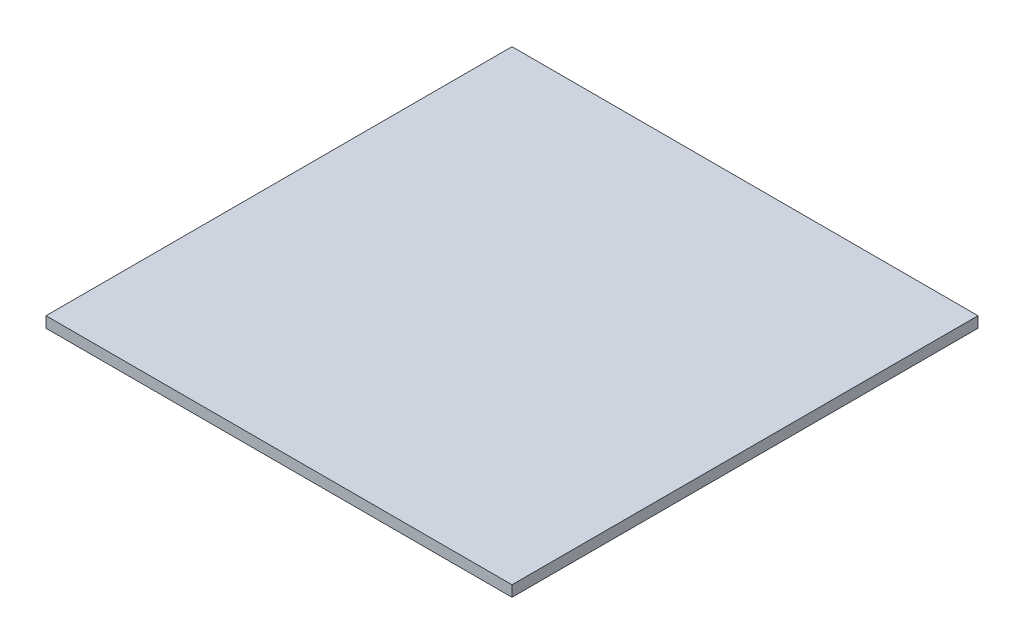
ISO-10303-21;
HEADER;
FILE_DESCRIPTION(('STEP AP214'),'2;1');
FILE_NAME('part.step','',(''),(''),'','','');
FILE_SCHEMA(('AUTOMOTIVE_DESIGN { 1 0 10303 214 1 1 1 1 }'));
ENDSEC;
DATA;
#1=APPLICATION_CONTEXT('core data for automotive mechanical design processes');
#2=APPLICATION_PROTOCOL_DEFINITION('international standard','automotive_design',2000,#1);
#3=PRODUCT_CONTEXT('',#1,'mechanical');
#4=PRODUCT('Part','Part','',(#3));
#5=PRODUCT_RELATED_PRODUCT_CATEGORY('part','',(#4));
#6=PRODUCT_DEFINITION_FORMATION('','',#4);
#7=PRODUCT_DEFINITION_CONTEXT('part definition',#1,'design');
#8=PRODUCT_DEFINITION('design','',#6,#7);
#9=PRODUCT_DEFINITION_SHAPE('','',#8);
#10=(LENGTH_UNIT() NAMED_UNIT(*) SI_UNIT(.MILLI.,.METRE.));
#11=(NAMED_UNIT(*) PLANE_ANGLE_UNIT() SI_UNIT($,.RADIAN.));
#12=(NAMED_UNIT(*) SI_UNIT($,.STERADIAN.) SOLID_ANGLE_UNIT());
#13=UNCERTAINTY_MEASURE_WITH_UNIT(LENGTH_MEASURE(1.E-05),#10,'distance_accuracy_value','');
#14=(GEOMETRIC_REPRESENTATION_CONTEXT(3) GLOBAL_UNCERTAINTY_ASSIGNED_CONTEXT((#13)) GLOBAL_UNIT_ASSIGNED_CONTEXT((#10,
#11,#12)) REPRESENTATION_CONTEXT('',''));
#15=CARTESIAN_POINT('',(0.,0.,0.));
#16=DIRECTION('',(0.,0.,1.));
#17=DIRECTION('',(1.,0.,0.));
#18=AXIS2_PLACEMENT_3D('',#15,#16,#17);
#19=CARTESIAN_POINT('',(107.,5.,107.));
#20=DIRECTION('',(-1.,0.,0.));
#21=DIRECTION('',(0.,0.,1.));
#22=AXIS2_PLACEMENT_3D('',#19,#20,#21);
#23=PLANE('',#22);
#24=DIRECTION('',(0.,0.,-1.));
#25=VECTOR('',#24,1.);
#26=CARTESIAN_POINT('',(107.,0.,107.));
#27=LINE('',#26,#25);
#28=CARTESIAN_POINT('',(107.,0.,107.));
#29=VERTEX_POINT('',#28);
#30=CARTESIAN_POINT('',(107.,0.,-107.));
#31=VERTEX_POINT('',#30);
#32=EDGE_CURVE('E99',#29,#31,#27,.T.);
#33=ORIENTED_EDGE('',*,*,#32,.T.);
#34=DIRECTION('',(0.,-1.,0.));
#35=VECTOR('',#34,1.);
#36=CARTESIAN_POINT('',(107.,5.,-107.));
#37=LINE('',#36,#35);
#38=CARTESIAN_POINT('',(107.,5.,-107.));
#39=VERTEX_POINT('',#38);
#40=EDGE_CURVE('E11',#39,#31,#37,.T.);
#41=ORIENTED_EDGE('',*,*,#40,.F.);
#42=DIRECTION('',(0.,0.,-1.));
#43=VECTOR('',#42,1.);
#44=CARTESIAN_POINT('',(107.,5.,107.));
#45=LINE('',#44,#43);
#46=CARTESIAN_POINT('',(107.,5.,107.));
#47=VERTEX_POINT('',#46);
#48=EDGE_CURVE('E87',#47,#39,#45,.T.);
#49=ORIENTED_EDGE('',*,*,#48,.F.);
#50=DIRECTION('',(0.,-1.,0.));
#51=VECTOR('',#50,1.);
#52=CARTESIAN_POINT('',(107.,5.,107.));
#53=LINE('',#52,#51);
#54=EDGE_CURVE('E95',#47,#29,#53,.T.);
#55=ORIENTED_EDGE('',*,*,#54,.T.);
#56=EDGE_LOOP('',(#33,#41,#49,#55));
#57=FACE_BOUND('',#56,.T.);
#58=ADVANCED_FACE('F36',(#57),#23,.F.);
#59=CARTESIAN_POINT('',(-107.,5.,-107.));
#60=DIRECTION('',(0.,0.,1.));
#61=DIRECTION('',(1.,0.,0.));
#62=AXIS2_PLACEMENT_3D('',#59,#60,#61);
#63=PLANE('',#62);
#64=DIRECTION('',(-1.,0.,0.));
#65=VECTOR('',#64,1.);
#66=CARTESIAN_POINT('',(-107.,0.,-107.));
#67=LINE('',#66,#65);
#68=CARTESIAN_POINT('',(-107.,0.,-107.));
#69=VERTEX_POINT('',#68);
#70=EDGE_CURVE('E91',#31,#69,#67,.T.);
#71=ORIENTED_EDGE('',*,*,#70,.T.);
#72=DIRECTION('',(0.,-1.,0.));
#73=VECTOR('',#72,1.);
#74=CARTESIAN_POINT('',(-107.,5.,-107.));
#75=LINE('',#74,#73);
#76=CARTESIAN_POINT('',(-107.,5.,-107.));
#77=VERTEX_POINT('',#76);
#78=EDGE_CURVE('E44',#77,#69,#75,.T.);
#79=ORIENTED_EDGE('',*,*,#78,.F.);
#80=DIRECTION('',(-1.,0.,0.));
#81=VECTOR('',#80,1.);
#82=CARTESIAN_POINT('',(-107.,5.,-107.));
#83=LINE('',#82,#81);
#84=EDGE_CURVE('E82',#39,#77,#83,.T.);
#85=ORIENTED_EDGE('',*,*,#84,.F.);
#86=ORIENTED_EDGE('',*,*,#40,.T.);
#87=EDGE_LOOP('',(#71,#79,#85,#86));
#88=FACE_BOUND('',#87,.T.);
#89=ADVANCED_FACE('F90',(#88),#63,.F.);
#90=CARTESIAN_POINT('',(-107.,5.,107.));
#91=DIRECTION('',(1.,0.,0.));
#92=DIRECTION('',(0.,0.,-1.));
#93=AXIS2_PLACEMENT_3D('',#90,#91,#92);
#94=PLANE('',#93);
#95=DIRECTION('',(0.,0.,1.));
#96=VECTOR('',#95,1.);
#97=CARTESIAN_POINT('',(-107.,0.,107.));
#98=LINE('',#97,#96);
#99=CARTESIAN_POINT('',(-107.,0.,107.));
#100=VERTEX_POINT('',#99);
#101=EDGE_CURVE('E69',#69,#100,#98,.T.);
#102=ORIENTED_EDGE('',*,*,#101,.T.);
#103=DIRECTION('',(0.,-1.,0.));
#104=VECTOR('',#103,1.);
#105=CARTESIAN_POINT('',(-107.,5.,107.));
#106=LINE('',#105,#104);
#107=CARTESIAN_POINT('',(-107.,5.,107.));
#108=VERTEX_POINT('',#107);
#109=EDGE_CURVE('E92',#108,#100,#106,.T.);
#110=ORIENTED_EDGE('',*,*,#109,.F.);
#111=DIRECTION('',(0.,0.,1.));
#112=VECTOR('',#111,1.);
#113=CARTESIAN_POINT('',(-107.,5.,107.));
#114=LINE('',#113,#112);
#115=EDGE_CURVE('E85',#77,#108,#114,.T.);
#116=ORIENTED_EDGE('',*,*,#115,.F.);
#117=ORIENTED_EDGE('',*,*,#78,.T.);
#118=EDGE_LOOP('',(#102,#110,#116,#117));
#119=FACE_BOUND('',#118,.T.);
#120=ADVANCED_FACE('F93',(#119),#94,.F.);
#121=CARTESIAN_POINT('',(-107.,5.,107.));
#122=DIRECTION('',(0.,0.,-1.));
#123=DIRECTION('',(-1.,0.,0.));
#124=AXIS2_PLACEMENT_3D('',#121,#122,#123);
#125=PLANE('',#124);
#126=DIRECTION('',(1.,0.,0.));
#127=VECTOR('',#126,1.);
#128=CARTESIAN_POINT('',(-107.,0.,107.));
#129=LINE('',#128,#127);
#130=EDGE_CURVE('E75',#100,#29,#129,.T.);
#131=ORIENTED_EDGE('',*,*,#130,.T.);
#132=ORIENTED_EDGE('',*,*,#54,.F.);
#133=DIRECTION('',(1.,0.,0.));
#134=VECTOR('',#133,1.);
#135=CARTESIAN_POINT('',(-107.,5.,107.));
#136=LINE('',#135,#134);
#137=EDGE_CURVE('E52',#108,#47,#136,.T.);
#138=ORIENTED_EDGE('',*,*,#137,.F.);
#139=ORIENTED_EDGE('',*,*,#109,.T.);
#140=EDGE_LOOP('',(#131,#132,#138,#139));
#141=FACE_BOUND('',#140,.T.);
#142=ADVANCED_FACE('F106',(#141),#125,.F.);
#143=CARTESIAN_POINT('',(0.,5.,0.));
#144=DIRECTION('',(0.,-1.,0.));
#145=DIRECTION('',(0.,0.,-1.));
#146=AXIS2_PLACEMENT_3D('',#143,#144,#145);
#147=PLANE('',#146);
#148=ORIENTED_EDGE('',*,*,#48,.T.);
#149=ORIENTED_EDGE('',*,*,#84,.T.);
#150=ORIENTED_EDGE('',*,*,#115,.T.);
#151=ORIENTED_EDGE('',*,*,#137,.T.);
#152=EDGE_LOOP('',(#148,#149,#150,#151));
#153=FACE_BOUND('',#152,.T.);
#154=ADVANCED_FACE('F83',(#153),#147,.F.);
#155=CARTESIAN_POINT('',(0.,0.,0.));
#156=DIRECTION('',(0.,-1.,0.));
#157=DIRECTION('',(0.,0.,-1.));
#158=AXIS2_PLACEMENT_3D('',#155,#156,#157);
#159=PLANE('',#158);
#160=ORIENTED_EDGE('',*,*,#32,.F.);
#161=ORIENTED_EDGE('',*,*,#130,.F.);
#162=ORIENTED_EDGE('',*,*,#101,.F.);
#163=ORIENTED_EDGE('',*,*,#70,.F.);
#164=EDGE_LOOP('',(#160,#161,#162,#163));
#165=FACE_BOUND('',#164,.T.);
#166=ADVANCED_FACE('F109',(#165),#159,.T.);
#167=CLOSED_SHELL('',(#58,#89,#120,#142,#154,#166));
#168=MANIFOLD_SOLID_BREP('B2',#167);
#169=ADVANCED_BREP_SHAPE_REPRESENTATION('',(#18,#168),#14);
#170=SHAPE_DEFINITION_REPRESENTATION(#9,#169);
ENDSEC;
END-ISO-10303-21;
